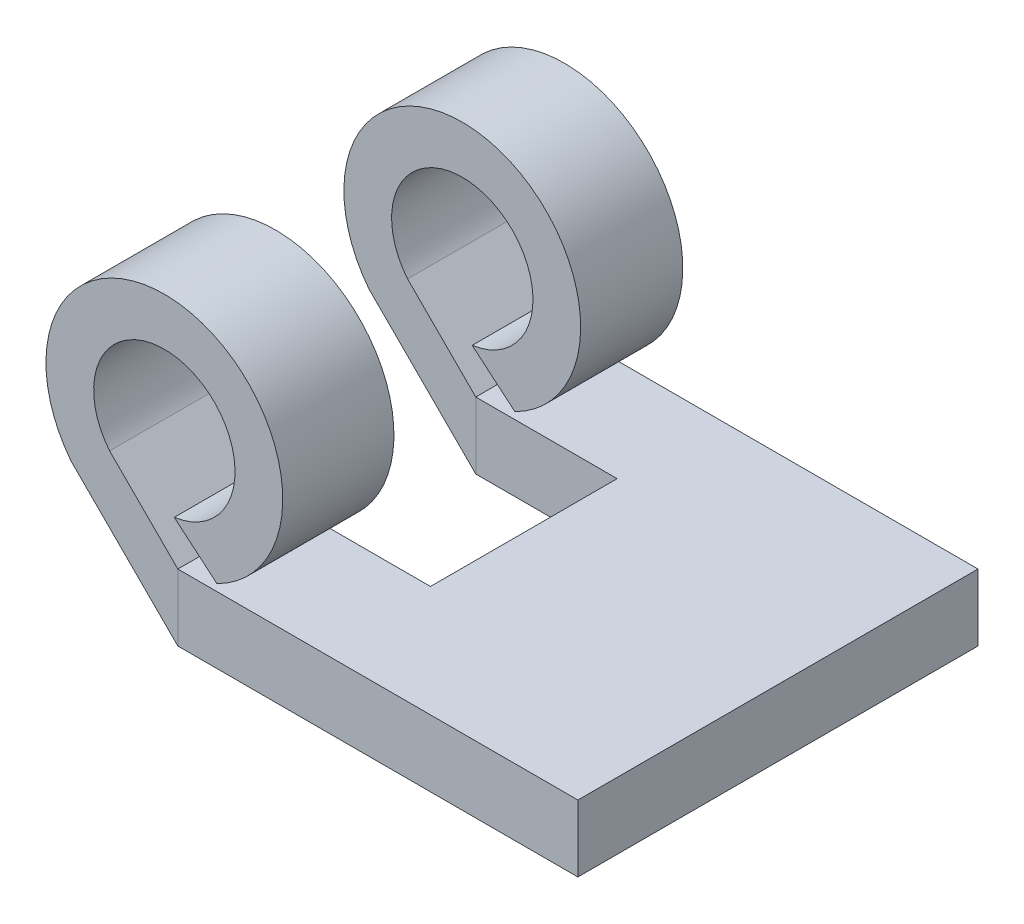
ISO-10303-21;
HEADER;
FILE_DESCRIPTION(('STEP AP214'),'2;1');
FILE_NAME('part.step','',(''),(''),'','','');
FILE_SCHEMA(('AUTOMOTIVE_DESIGN { 1 0 10303 214 1 1 1 1 }'));
ENDSEC;
DATA;
#1=APPLICATION_CONTEXT('core data for automotive mechanical design processes');
#2=APPLICATION_PROTOCOL_DEFINITION('international standard','automotive_design',2000,#1);
#3=PRODUCT_CONTEXT('',#1,'mechanical');
#4=PRODUCT('Part','Part','',(#3));
#5=PRODUCT_RELATED_PRODUCT_CATEGORY('part','',(#4));
#6=PRODUCT_DEFINITION_FORMATION('','',#4);
#7=PRODUCT_DEFINITION_CONTEXT('part definition',#1,'design');
#8=PRODUCT_DEFINITION('design','',#6,#7);
#9=PRODUCT_DEFINITION_SHAPE('','',#8);
#10=(LENGTH_UNIT() NAMED_UNIT(*) SI_UNIT(.MILLI.,.METRE.));
#11=(NAMED_UNIT(*) PLANE_ANGLE_UNIT() SI_UNIT($,.RADIAN.));
#12=(NAMED_UNIT(*) SI_UNIT($,.STERADIAN.) SOLID_ANGLE_UNIT());
#13=UNCERTAINTY_MEASURE_WITH_UNIT(LENGTH_MEASURE(1.E-05),#10,'distance_accuracy_value','');
#14=(GEOMETRIC_REPRESENTATION_CONTEXT(3) GLOBAL_UNCERTAINTY_ASSIGNED_CONTEXT((#13)) GLOBAL_UNIT_ASSIGNED_CONTEXT((#10,
#11,#12)) REPRESENTATION_CONTEXT('',''));
#15=CARTESIAN_POINT('',(0.,0.,0.));
#16=DIRECTION('',(0.,0.,1.));
#17=DIRECTION('',(1.,0.,0.));
#18=AXIS2_PLACEMENT_3D('',#15,#16,#17);
#19=CARTESIAN_POINT('',(0.,0.,0.));
#20=DIRECTION('',(1.,0.,0.));
#21=DIRECTION('',(0.,0.,-1.));
#22=AXIS2_PLACEMENT_3D('',#19,#20,#21);
#23=PLANE('',#22);
#24=DIRECTION('',(0.,1.,0.));
#25=VECTOR('',#24,1.);
#26=CARTESIAN_POINT('',(0.,0.,4.8641));
#27=LINE('',#26,#25);
#28=CARTESIAN_POINT('',(0.,0.,4.8641));
#29=VERTEX_POINT('',#28);
#30=CARTESIAN_POINT('',(0.,3.175,4.8641));
#31=VERTEX_POINT('',#30);
#32=EDGE_CURVE('E81',#29,#31,#27,.T.);
#33=ORIENTED_EDGE('',*,*,#32,.F.);
#34=DIRECTION('',(0.,0.,1.));
#35=VECTOR('',#34,1.);
#36=CARTESIAN_POINT('',(0.,0.,0.));
#37=LINE('',#36,#35);
#38=CARTESIAN_POINT('',(0.,0.,0.));
#39=VERTEX_POINT('',#38);
#40=EDGE_CURVE('E134',#39,#29,#37,.T.);
#41=ORIENTED_EDGE('',*,*,#40,.F.);
#42=DIRECTION('',(0.,1.,0.));
#43=VECTOR('',#42,1.);
#44=CARTESIAN_POINT('',(0.,0.,0.));
#45=LINE('',#44,#43);
#46=CARTESIAN_POINT('',(0.,3.175,0.));
#47=VERTEX_POINT('',#46);
#48=EDGE_CURVE('E127',#39,#47,#45,.T.);
#49=ORIENTED_EDGE('',*,*,#48,.T.);
#50=DIRECTION('',(0.,0.,1.));
#51=VECTOR('',#50,1.);
#52=CARTESIAN_POINT('',(0.,3.175,0.));
#53=LINE('',#52,#51);
#54=EDGE_CURVE('E50',#47,#31,#53,.T.);
#55=ORIENTED_EDGE('',*,*,#54,.T.);
#56=EDGE_LOOP('',(#33,#41,#49,#55));
#57=FACE_BOUND('',#56,.T.);
#58=ADVANCED_FACE('F47',(#57),#23,.T.);
#59=CARTESIAN_POINT('',(0.,0.,0.));
#60=DIRECTION('',(-0.707106781186544,-0.707106781186551,0.));
#61=DIRECTION('',(0.707106781186551,-0.707106781186544,0.));
#62=AXIS2_PLACEMENT_3D('',#59,#60,#61);
#63=PLANE('',#62);
#64=DIRECTION('',(0.707106781186551,-0.707106781186544,0.));
#65=VECTOR('',#64,1.);
#66=CARTESIAN_POINT('',(0.,0.,4.8641));
#67=LINE('',#66,#65);
#68=CARTESIAN_POINT('',(-5.08568187270977,5.08568187270972,4.8641));
#69=VERTEX_POINT('',#68);
#70=EDGE_CURVE('E12',#69,#29,#67,.T.);
#71=ORIENTED_EDGE('',*,*,#70,.F.);
#72=DIRECTION('',(0.,0.,1.));
#73=VECTOR('',#72,1.);
#74=CARTESIAN_POINT('',(-5.08568187270977,5.08568187270972,0.));
#75=LINE('',#74,#73);
#76=CARTESIAN_POINT('',(-5.08568187270977,5.08568187270972,0.));
#77=VERTEX_POINT('',#76);
#78=EDGE_CURVE('E139',#77,#69,#75,.T.);
#79=ORIENTED_EDGE('',*,*,#78,.F.);
#80=DIRECTION('',(0.707106781186551,-0.707106781186544,0.));
#81=VECTOR('',#80,1.);
#82=CARTESIAN_POINT('',(0.,0.,0.));
#83=LINE('',#82,#81);
#84=EDGE_CURVE('E138',#77,#39,#83,.T.);
#85=ORIENTED_EDGE('',*,*,#84,.T.);
#86=ORIENTED_EDGE('',*,*,#40,.T.);
#87=EDGE_LOOP('',(#71,#79,#85,#86));
#88=FACE_BOUND('',#87,.T.);
#89=ADVANCED_FACE('F155',(#88),#63,.T.);
#90=CARTESIAN_POINT('',(-0.641949721424772,8.55291528774449,0.));
#91=DIRECTION('',(0.,0.,1.));
#92=DIRECTION('',(1.,0.,0.));
#93=AXIS2_PLACEMENT_3D('',#90,#91,#92);
#94=CYLINDRICAL_SURFACE('',#93,5.63635192182831);
#95=CARTESIAN_POINT('',(-0.641949721424772,8.55291528774449,4.8641));
#96=DIRECTION('',(0.,0.,-1.));
#97=DIRECTION('',(-1.,0.,0.));
#98=AXIS2_PLACEMENT_3D('',#95,#96,#97);
#99=CIRCLE('',#98,5.63635192182831);
#100=CARTESIAN_POINT('',(1.86194414479549,3.5032639638012,4.8641));
#101=VERTEX_POINT('',#100);
#102=EDGE_CURVE('E55',#101,#69,#99,.F.);
#103=ORIENTED_EDGE('',*,*,#102,.F.);
#104=DIRECTION('',(0.,0.,1.));
#105=VECTOR('',#104,1.);
#106=CARTESIAN_POINT('',(1.86194414479549,3.5032639638012,0.));
#107=LINE('',#106,#105);
#108=CARTESIAN_POINT('',(1.86194414479549,3.5032639638012,0.));
#109=VERTEX_POINT('',#108);
#110=EDGE_CURVE('E119',#109,#101,#107,.T.);
#111=ORIENTED_EDGE('',*,*,#110,.F.);
#112=CARTESIAN_POINT('',(-0.641949721424772,8.55291528774449,0.));
#113=DIRECTION('',(0.,0.,1.));
#114=DIRECTION('',(-1.,0.,0.));
#115=AXIS2_PLACEMENT_3D('',#112,#113,#114);
#116=CIRCLE('',#115,5.63635192182831);
#117=EDGE_CURVE('E137',#109,#77,#116,.T.);
#118=ORIENTED_EDGE('',*,*,#117,.T.);
#119=ORIENTED_EDGE('',*,*,#78,.T.);
#120=EDGE_LOOP('',(#103,#111,#118,#119));
#121=FACE_BOUND('',#120,.T.);
#122=ADVANCED_FACE('F154',(#121),#94,.T.);
#123=CARTESIAN_POINT('',(-0.16937301081823,5.22075960371766,0.));
#124=DIRECTION('',(-0.645654947608014,-0.763629287435528,0.));
#125=DIRECTION('',(0.763629287435528,-0.645654947608014,0.));
#126=AXIS2_PLACEMENT_3D('',#123,#124,#125);
#127=PLANE('',#126);
#128=DIRECTION('',(0.763629287435528,-0.645654947608014,0.));
#129=VECTOR('',#128,1.);
#130=CARTESIAN_POINT('',(-0.16937301081823,5.22075960371766,4.8641));
#131=LINE('',#130,#129);
#132=CARTESIAN_POINT('',(-0.169373010818233,5.22075960371766,4.8641));
#133=VERTEX_POINT('',#132);
#134=EDGE_CURVE('E131',#133,#101,#131,.T.);
#135=ORIENTED_EDGE('',*,*,#134,.F.);
#136=DIRECTION('',(0.,0.,1.));
#137=VECTOR('',#136,1.);
#138=CARTESIAN_POINT('',(-0.169373010818233,5.22075960371766,0.));
#139=LINE('',#138,#137);
#140=CARTESIAN_POINT('',(-0.169373010818233,5.22075960371766,0.));
#141=VERTEX_POINT('',#140);
#142=EDGE_CURVE('E118',#141,#133,#139,.T.);
#143=ORIENTED_EDGE('',*,*,#142,.F.);
#144=DIRECTION('',(0.763629287435528,-0.645654947608014,0.));
#145=VECTOR('',#144,1.);
#146=CARTESIAN_POINT('',(-0.16937301081823,5.22075960371766,0.));
#147=LINE('',#146,#145);
#148=EDGE_CURVE('E117',#141,#109,#147,.T.);
#149=ORIENTED_EDGE('',*,*,#148,.T.);
#150=ORIENTED_EDGE('',*,*,#110,.T.);
#151=EDGE_LOOP('',(#135,#143,#149,#150));
#152=FACE_BOUND('',#151,.T.);
#153=ADVANCED_FACE('F161',(#152),#127,.T.);
#154=CARTESIAN_POINT('',(-0.641949721424772,8.55291528774449,0.));
#155=DIRECTION('',(0.,0.,1.));
#156=DIRECTION('',(1.,0.,0.));
#157=AXIS2_PLACEMENT_3D('',#154,#155,#156);
#158=CYLINDRICAL_SURFACE('',#157,3.3655);
#159=CARTESIAN_POINT('',(-0.641949721424772,8.55291528774449,4.8641));
#160=DIRECTION('',(0.,0.,-1.));
#161=DIRECTION('',(-1.,0.,0.));
#162=AXIS2_PLACEMENT_3D('',#159,#160,#161);
#163=CIRCLE('',#162,3.3655);
#164=CARTESIAN_POINT('',(-3.24647565848772,6.42147565848768,4.8641));
#165=VERTEX_POINT('',#164);
#166=EDGE_CURVE('E105',#165,#133,#163,.T.);
#167=ORIENTED_EDGE('',*,*,#166,.F.);
#168=DIRECTION('',(0.,0.,1.));
#169=VECTOR('',#168,1.);
#170=CARTESIAN_POINT('',(-3.24647565848772,6.42147565848768,0.));
#171=LINE('',#170,#169);
#172=CARTESIAN_POINT('',(-3.24647565848772,6.42147565848768,0.));
#173=VERTEX_POINT('',#172);
#174=EDGE_CURVE('E100',#173,#165,#171,.T.);
#175=ORIENTED_EDGE('',*,*,#174,.F.);
#176=CARTESIAN_POINT('',(-0.641949721424772,8.55291528774449,0.));
#177=DIRECTION('',(0.,0.,-1.));
#178=DIRECTION('',(-1.,0.,0.));
#179=AXIS2_PLACEMENT_3D('',#176,#177,#178);
#180=CIRCLE('',#179,3.3655);
#181=EDGE_CURVE('E104',#173,#141,#180,.T.);
#182=ORIENTED_EDGE('',*,*,#181,.T.);
#183=ORIENTED_EDGE('',*,*,#142,.T.);
#184=EDGE_LOOP('',(#167,#175,#182,#183));
#185=FACE_BOUND('',#184,.T.);
#186=ADVANCED_FACE('F102',(#185),#158,.F.);
#187=CARTESIAN_POINT('',(0.,3.175,0.));
#188=DIRECTION('',(0.707106781186544,0.707106781186551,0.));
#189=DIRECTION('',(-0.707106781186551,0.707106781186544,0.));
#190=AXIS2_PLACEMENT_3D('',#187,#188,#189);
#191=PLANE('',#190);
#192=DIRECTION('',(-0.707106781186551,0.707106781186544,0.));
#193=VECTOR('',#192,1.);
#194=CARTESIAN_POINT('',(0.,3.175,4.8641));
#195=LINE('',#194,#193);
#196=EDGE_CURVE('E78',#31,#165,#195,.T.);
#197=ORIENTED_EDGE('',*,*,#196,.F.);
#198=ORIENTED_EDGE('',*,*,#54,.F.);
#199=DIRECTION('',(-0.707106781186551,0.707106781186544,0.));
#200=VECTOR('',#199,1.);
#201=CARTESIAN_POINT('',(0.,3.175,0.));
#202=LINE('',#201,#200);
#203=EDGE_CURVE('E108',#47,#173,#202,.T.);
#204=ORIENTED_EDGE('',*,*,#203,.T.);
#205=ORIENTED_EDGE('',*,*,#174,.T.);
#206=EDGE_LOOP('',(#197,#198,#204,#205));
#207=FACE_BOUND('',#206,.T.);
#208=ADVANCED_FACE('F121',(#207),#191,.T.);
#209=CARTESIAN_POINT('',(-0.641949721424772,8.55291528774449,0.));
#210=DIRECTION('',(0.,0.,-1.));
#211=DIRECTION('',(-1.,0.,0.));
#212=AXIS2_PLACEMENT_3D('',#209,#210,#211);
#213=PLANE('',#212);
#214=ORIENTED_EDGE('',*,*,#48,.F.);
#215=ORIENTED_EDGE('',*,*,#84,.F.);
#216=ORIENTED_EDGE('',*,*,#117,.F.);
#217=ORIENTED_EDGE('',*,*,#148,.F.);
#218=ORIENTED_EDGE('',*,*,#181,.F.);
#219=ORIENTED_EDGE('',*,*,#203,.F.);
#220=EDGE_LOOP('',(#214,#215,#216,#217,#218,#219));
#221=FACE_BOUND('',#220,.T.);
#222=ADVANCED_FACE('F113',(#221),#213,.T.);
#223=CARTESIAN_POINT('',(6.73332256851049,19.05,4.8641));
#224=DIRECTION('',(0.,0.,-1.));
#225=DIRECTION('',(-1.,0.,0.));
#226=AXIS2_PLACEMENT_3D('',#223,#224,#225);
#227=PLANE('',#226);
#228=ORIENTED_EDGE('',*,*,#32,.T.);
#229=ORIENTED_EDGE('',*,*,#196,.T.);
#230=ORIENTED_EDGE('',*,*,#166,.T.);
#231=ORIENTED_EDGE('',*,*,#134,.T.);
#232=ORIENTED_EDGE('',*,*,#102,.T.);
#233=ORIENTED_EDGE('',*,*,#70,.T.);
#234=EDGE_LOOP('',(#228,#229,#230,#231,#232,#233));
#235=FACE_BOUND('',#234,.T.);
#236=ADVANCED_FACE('F170',(#235),#227,.F.);
#237=CLOSED_SHELL('',(#58,#89,#122,#153,#186,#208,#222,#236));
#238=MANIFOLD_SOLID_BREP('B2',#237);
#239=CARTESIAN_POINT('',(-0.641949721424772,8.55291528774449,19.05));
#240=DIRECTION('',(0.,0.,-1.));
#241=DIRECTION('',(-1.,0.,0.));
#242=AXIS2_PLACEMENT_3D('',#239,#240,#241);
#243=PLANE('',#242);
#244=DIRECTION('',(0.,1.,0.));
#245=VECTOR('',#244,1.);
#246=CARTESIAN_POINT('',(0.,0.,19.05));
#247=LINE('',#246,#245);
#248=CARTESIAN_POINT('',(0.,0.,19.05));
#249=VERTEX_POINT('',#248);
#250=CARTESIAN_POINT('',(0.,3.175,19.05));
#251=VERTEX_POINT('',#250);
#252=EDGE_CURVE('E288',#249,#251,#247,.T.);
#253=ORIENTED_EDGE('',*,*,#252,.T.);
#254=DIRECTION('',(-0.707106781186551,0.707106781186544,0.));
#255=VECTOR('',#254,1.);
#256=CARTESIAN_POINT('',(0.,3.175,19.05));
#257=LINE('',#256,#255);
#258=CARTESIAN_POINT('',(-3.24647565848772,6.42147565848768,19.05));
#259=VERTEX_POINT('',#258);
#260=EDGE_CURVE('E321',#251,#259,#257,.T.);
#261=ORIENTED_EDGE('',*,*,#260,.T.);
#262=CARTESIAN_POINT('',(-0.641949721424772,8.55291528774449,19.05));
#263=DIRECTION('',(0.,0.,-1.));
#264=DIRECTION('',(-1.,0.,0.));
#265=AXIS2_PLACEMENT_3D('',#262,#263,#264);
#266=CIRCLE('',#265,3.3655);
#267=CARTESIAN_POINT('',(-0.169373010818233,5.22075960371766,19.05));
#268=VERTEX_POINT('',#267);
#269=EDGE_CURVE('E316',#259,#268,#266,.T.);
#270=ORIENTED_EDGE('',*,*,#269,.T.);
#271=DIRECTION('',(0.763629287435528,-0.645654947608014,0.));
#272=VECTOR('',#271,1.);
#273=CARTESIAN_POINT('',(-0.16937301081823,5.22075960371766,19.05));
#274=LINE('',#273,#272);
#275=CARTESIAN_POINT('',(1.86194414479549,3.5032639638012,19.05));
#276=VERTEX_POINT('',#275);
#277=EDGE_CURVE('E313',#268,#276,#274,.T.);
#278=ORIENTED_EDGE('',*,*,#277,.T.);
#279=CARTESIAN_POINT('',(-0.641949721424772,8.55291528774449,19.05));
#280=DIRECTION('',(0.,0.,1.));
#281=DIRECTION('',(-1.,0.,0.));
#282=AXIS2_PLACEMENT_3D('',#279,#280,#281);
#283=CIRCLE('',#282,5.63635192182831);
#284=CARTESIAN_POINT('',(-5.08568187270977,5.08568187270972,19.05));
#285=VERTEX_POINT('',#284);
#286=EDGE_CURVE('E310',#276,#285,#283,.T.);
#287=ORIENTED_EDGE('',*,*,#286,.T.);
#288=DIRECTION('',(0.707106781186551,-0.707106781186544,0.));
#289=VECTOR('',#288,1.);
#290=CARTESIAN_POINT('',(0.,0.,19.05));
#291=LINE('',#290,#289);
#292=EDGE_CURVE('E301',#285,#249,#291,.T.);
#293=ORIENTED_EDGE('',*,*,#292,.T.);
#294=EDGE_LOOP('',(#253,#261,#270,#278,#287,#293));
#295=FACE_BOUND('',#294,.T.);
#296=ADVANCED_FACE('F231',(#295),#243,.F.);
#297=CARTESIAN_POINT('',(0.,3.175,0.));
#298=DIRECTION('',(0.707106781186544,0.707106781186551,0.));
#299=DIRECTION('',(-0.707106781186551,0.707106781186544,0.));
#300=AXIS2_PLACEMENT_3D('',#297,#298,#299);
#301=PLANE('',#300);
#302=DIRECTION('',(0.707106781186551,-0.707106781186544,0.));
#303=VECTOR('',#302,1.);
#304=CARTESIAN_POINT('',(0.,3.175,13.7541));
#305=LINE('',#304,#303);
#306=CARTESIAN_POINT('',(-3.24647565848772,6.42147565848768,13.7541));
#307=VERTEX_POINT('',#306);
#308=CARTESIAN_POINT('',(0.,3.175,13.7541));
#309=VERTEX_POINT('',#308);
#310=EDGE_CURVE('E45',#307,#309,#305,.T.);
#311=ORIENTED_EDGE('',*,*,#310,.F.);
#312=DIRECTION('',(0.,0.,1.));
#313=VECTOR('',#312,1.);
#314=CARTESIAN_POINT('',(-3.24647565848772,6.42147565848768,0.));
#315=LINE('',#314,#313);
#316=EDGE_CURVE('E307',#307,#259,#315,.T.);
#317=ORIENTED_EDGE('',*,*,#316,.T.);
#318=ORIENTED_EDGE('',*,*,#260,.F.);
#319=DIRECTION('',(0.,0.,1.));
#320=VECTOR('',#319,1.);
#321=CARTESIAN_POINT('',(0.,3.175,0.));
#322=LINE('',#321,#320);
#323=EDGE_CURVE('E308',#309,#251,#322,.T.);
#324=ORIENTED_EDGE('',*,*,#323,.F.);
#325=EDGE_LOOP('',(#311,#317,#318,#324));
#326=FACE_BOUND('',#325,.T.);
#327=ADVANCED_FACE('F339',(#326),#301,.T.);
#328=CARTESIAN_POINT('',(-0.641949721424772,8.55291528774449,0.));
#329=DIRECTION('',(0.,0.,1.));
#330=DIRECTION('',(1.,0.,0.));
#331=AXIS2_PLACEMENT_3D('',#328,#329,#330);
#332=CYLINDRICAL_SURFACE('',#331,3.3655);
#333=CARTESIAN_POINT('',(-0.641949721424772,8.55291528774449,13.7541));
#334=DIRECTION('',(0.,0.,1.));
#335=DIRECTION('',(1.,0.,0.));
#336=AXIS2_PLACEMENT_3D('',#333,#334,#335);
#337=CIRCLE('',#336,3.3655);
#338=CARTESIAN_POINT('',(-0.169373010818233,5.22075960371766,13.7541));
#339=VERTEX_POINT('',#338);
#340=EDGE_CURVE('E245',#339,#307,#337,.T.);
#341=ORIENTED_EDGE('',*,*,#340,.F.);
#342=DIRECTION('',(0.,0.,1.));
#343=VECTOR('',#342,1.);
#344=CARTESIAN_POINT('',(-0.169373010818233,5.22075960371766,0.));
#345=LINE('',#344,#343);
#346=EDGE_CURVE('E305',#339,#268,#345,.T.);
#347=ORIENTED_EDGE('',*,*,#346,.T.);
#348=ORIENTED_EDGE('',*,*,#269,.F.);
#349=ORIENTED_EDGE('',*,*,#316,.F.);
#350=EDGE_LOOP('',(#341,#347,#348,#349));
#351=FACE_BOUND('',#350,.T.);
#352=ADVANCED_FACE('F334',(#351),#332,.F.);
#353=CARTESIAN_POINT('',(-0.16937301081823,5.22075960371766,0.));
#354=DIRECTION('',(-0.645654947608014,-0.763629287435528,0.));
#355=DIRECTION('',(0.763629287435528,-0.645654947608014,0.));
#356=AXIS2_PLACEMENT_3D('',#353,#354,#355);
#357=PLANE('',#356);
#358=DIRECTION('',(-0.763629287435528,0.645654947608014,0.));
#359=VECTOR('',#358,1.);
#360=CARTESIAN_POINT('',(-0.169373010818231,5.22075960371766,13.7541));
#361=LINE('',#360,#359);
#362=CARTESIAN_POINT('',(1.86194414479549,3.5032639638012,13.7541));
#363=VERTEX_POINT('',#362);
#364=EDGE_CURVE('E326',#363,#339,#361,.T.);
#365=ORIENTED_EDGE('',*,*,#364,.F.);
#366=DIRECTION('',(0.,0.,1.));
#367=VECTOR('',#366,1.);
#368=CARTESIAN_POINT('',(1.86194414479549,3.5032639638012,0.));
#369=LINE('',#368,#367);
#370=EDGE_CURVE('E298',#363,#276,#369,.T.);
#371=ORIENTED_EDGE('',*,*,#370,.T.);
#372=ORIENTED_EDGE('',*,*,#277,.F.);
#373=ORIENTED_EDGE('',*,*,#346,.F.);
#374=EDGE_LOOP('',(#365,#371,#372,#373));
#375=FACE_BOUND('',#374,.T.);
#376=ADVANCED_FACE('F337',(#375),#357,.T.);
#377=CARTESIAN_POINT('',(-0.641949721424772,8.55291528774449,0.));
#378=DIRECTION('',(0.,0.,1.));
#379=DIRECTION('',(1.,0.,0.));
#380=AXIS2_PLACEMENT_3D('',#377,#378,#379);
#381=CYLINDRICAL_SURFACE('',#380,5.63635192182831);
#382=CARTESIAN_POINT('',(-0.641949721424772,8.55291528774449,13.7541));
#383=DIRECTION('',(0.,0.,1.));
#384=DIRECTION('',(1.,0.,0.));
#385=AXIS2_PLACEMENT_3D('',#382,#383,#384);
#386=CIRCLE('',#385,5.63635192182831);
#387=CARTESIAN_POINT('',(-5.08568187270977,5.08568187270972,13.7541));
#388=VERTEX_POINT('',#387);
#389=EDGE_CURVE('E293',#388,#363,#386,.F.);
#390=ORIENTED_EDGE('',*,*,#389,.F.);
#391=DIRECTION('',(0.,0.,1.));
#392=VECTOR('',#391,1.);
#393=CARTESIAN_POINT('',(-5.08568187270977,5.08568187270972,0.));
#394=LINE('',#393,#392);
#395=EDGE_CURVE('E292',#388,#285,#394,.T.);
#396=ORIENTED_EDGE('',*,*,#395,.T.);
#397=ORIENTED_EDGE('',*,*,#286,.F.);
#398=ORIENTED_EDGE('',*,*,#370,.F.);
#399=EDGE_LOOP('',(#390,#396,#397,#398));
#400=FACE_BOUND('',#399,.T.);
#401=ADVANCED_FACE('F350',(#400),#381,.T.);
#402=CARTESIAN_POINT('',(0.,0.,0.));
#403=DIRECTION('',(-0.707106781186544,-0.707106781186551,0.));
#404=DIRECTION('',(0.707106781186551,-0.707106781186544,0.));
#405=AXIS2_PLACEMENT_3D('',#402,#403,#404);
#406=PLANE('',#405);
#407=DIRECTION('',(-0.707106781186551,0.707106781186544,0.));
#408=VECTOR('',#407,1.);
#409=CARTESIAN_POINT('',(0.,0.,13.7541));
#410=LINE('',#409,#408);
#411=CARTESIAN_POINT('',(0.,0.,13.7541));
#412=VERTEX_POINT('',#411);
#413=EDGE_CURVE('E284',#412,#388,#410,.T.);
#414=ORIENTED_EDGE('',*,*,#413,.F.);
#415=DIRECTION('',(0.,0.,1.));
#416=VECTOR('',#415,1.);
#417=CARTESIAN_POINT('',(0.,0.,0.));
#418=LINE('',#417,#416);
#419=EDGE_CURVE('E239',#412,#249,#418,.T.);
#420=ORIENTED_EDGE('',*,*,#419,.T.);
#421=ORIENTED_EDGE('',*,*,#292,.F.);
#422=ORIENTED_EDGE('',*,*,#395,.F.);
#423=EDGE_LOOP('',(#414,#420,#421,#422));
#424=FACE_BOUND('',#423,.T.);
#425=ADVANCED_FACE('F291',(#424),#406,.T.);
#426=CARTESIAN_POINT('',(0.,0.,0.));
#427=DIRECTION('',(1.,0.,0.));
#428=DIRECTION('',(0.,0.,-1.));
#429=AXIS2_PLACEMENT_3D('',#426,#427,#428);
#430=PLANE('',#429);
#431=DIRECTION('',(0.,-1.,0.));
#432=VECTOR('',#431,1.);
#433=CARTESIAN_POINT('',(0.,0.,13.7541));
#434=LINE('',#433,#432);
#435=EDGE_CURVE('E282',#309,#412,#434,.T.);
#436=ORIENTED_EDGE('',*,*,#435,.F.);
#437=ORIENTED_EDGE('',*,*,#323,.T.);
#438=ORIENTED_EDGE('',*,*,#252,.F.);
#439=ORIENTED_EDGE('',*,*,#419,.F.);
#440=EDGE_LOOP('',(#436,#437,#438,#439));
#441=FACE_BOUND('',#440,.T.);
#442=ADVANCED_FACE('F233',(#441),#430,.T.);
#443=CARTESIAN_POINT('',(6.73332256851049,19.05,13.7541));
#444=DIRECTION('',(0.,0.,1.));
#445=DIRECTION('',(1.,0.,0.));
#446=AXIS2_PLACEMENT_3D('',#443,#444,#445);
#447=PLANE('',#446);
#448=ORIENTED_EDGE('',*,*,#435,.T.);
#449=ORIENTED_EDGE('',*,*,#413,.T.);
#450=ORIENTED_EDGE('',*,*,#389,.T.);
#451=ORIENTED_EDGE('',*,*,#364,.T.);
#452=ORIENTED_EDGE('',*,*,#340,.T.);
#453=ORIENTED_EDGE('',*,*,#310,.T.);
#454=EDGE_LOOP('',(#448,#449,#450,#451,#452,#453));
#455=FACE_BOUND('',#454,.T.);
#456=ADVANCED_FACE('F283',(#455),#447,.F.);
#457=CLOSED_SHELL('',(#296,#327,#352,#376,#401,#425,#442,#456));
#458=MANIFOLD_SOLID_BREP('B6',#457);
#459=CARTESIAN_POINT('',(0.,0.,19.05));
#460=DIRECTION('',(1.,0.,0.));
#461=DIRECTION('',(0.,0.,-1.));
#462=AXIS2_PLACEMENT_3D('',#459,#460,#461);
#463=PLANE('',#462);
#464=DIRECTION('',(0.,0.,-1.));
#465=VECTOR('',#464,1.);
#466=CARTESIAN_POINT('',(0.,0.,19.05));
#467=LINE('',#466,#465);
#468=CARTESIAN_POINT('',(0.,0.,4.8641));
#469=VERTEX_POINT('',#468);
#470=CARTESIAN_POINT('',(0.,0.,0.));
#471=VERTEX_POINT('',#470);
#472=EDGE_CURVE('E531',#469,#471,#467,.T.);
#473=ORIENTED_EDGE('',*,*,#472,.F.);
#474=DIRECTION('',(0.,1.,0.));
#475=VECTOR('',#474,1.);
#476=CARTESIAN_POINT('',(0.,0.,4.8641));
#477=LINE('',#476,#475);
#478=CARTESIAN_POINT('',(0.,3.175,4.8641));
#479=VERTEX_POINT('',#478);
#480=EDGE_CURVE('E506',#469,#479,#477,.T.);
#481=ORIENTED_EDGE('',*,*,#480,.T.);
#482=DIRECTION('',(0.,0.,-1.));
#483=VECTOR('',#482,1.);
#484=CARTESIAN_POINT('',(0.,3.175,19.05));
#485=LINE('',#484,#483);
#486=CARTESIAN_POINT('',(0.,3.175,0.));
#487=VERTEX_POINT('',#486);
#488=EDGE_CURVE('E452',#479,#487,#485,.T.);
#489=ORIENTED_EDGE('',*,*,#488,.T.);
#490=DIRECTION('',(0.,-1.,0.));
#491=VECTOR('',#490,1.);
#492=CARTESIAN_POINT('',(0.,0.,0.));
#493=LINE('',#492,#491);
#494=EDGE_CURVE('E508',#487,#471,#493,.T.);
#495=ORIENTED_EDGE('',*,*,#494,.T.);
#496=EDGE_LOOP('',(#473,#481,#489,#495));
#497=FACE_BOUND('',#496,.T.);
#498=ADVANCED_FACE('F406',(#497),#463,.F.);
#499=CARTESIAN_POINT('',(0.,3.175,19.05));
#500=VERTEX_POINT('',#499);
#501=CARTESIAN_POINT('',(0.,3.175,13.7541));
#502=VERTEX_POINT('',#501);
#503=EDGE_CURVE('E522',#500,#502,#485,.T.);
#504=ORIENTED_EDGE('',*,*,#503,.T.);
#505=DIRECTION('',(0.,-1.,0.));
#506=VECTOR('',#505,1.);
#507=CARTESIAN_POINT('',(0.,0.,13.7541));
#508=LINE('',#507,#506);
#509=CARTESIAN_POINT('',(0.,0.,13.7541));
#510=VERTEX_POINT('',#509);
#511=EDGE_CURVE('E421',#502,#510,#508,.T.);
#512=ORIENTED_EDGE('',*,*,#511,.T.);
#513=CARTESIAN_POINT('',(0.,0.,19.05));
#514=VERTEX_POINT('',#513);
#515=EDGE_CURVE('E500',#514,#510,#467,.T.);
#516=ORIENTED_EDGE('',*,*,#515,.F.);
#517=DIRECTION('',(0.,-1.,0.));
#518=VECTOR('',#517,1.);
#519=CARTESIAN_POINT('',(0.,0.,19.05));
#520=LINE('',#519,#518);
#521=EDGE_CURVE('E509',#500,#514,#520,.T.);
#522=ORIENTED_EDGE('',*,*,#521,.F.);
#523=EDGE_LOOP('',(#504,#512,#516,#522));
#524=FACE_BOUND('',#523,.T.);
#525=ADVANCED_FACE('F408',(#524),#463,.F.);
#526=CARTESIAN_POINT('',(0.,0.,19.05));
#527=DIRECTION('',(0.,1.,0.));
#528=DIRECTION('',(0.,0.,1.));
#529=AXIS2_PLACEMENT_3D('',#526,#527,#528);
#530=PLANE('',#529);
#531=DIRECTION('',(0.,0.,1.));
#532=VECTOR('',#531,1.);
#533=CARTESIAN_POINT('',(6.73332256851049,0.,13.7541));
#534=LINE('',#533,#532);
#535=CARTESIAN_POINT('',(6.73332256851049,0.,4.8641));
#536=VERTEX_POINT('',#535);
#537=CARTESIAN_POINT('',(6.73332256851049,0.,13.7541));
#538=VERTEX_POINT('',#537);
#539=EDGE_CURVE('E492',#536,#538,#534,.T.);
#540=ORIENTED_EDGE('',*,*,#539,.F.);
#541=DIRECTION('',(1.,0.,0.));
#542=VECTOR('',#541,1.);
#543=CARTESIAN_POINT('',(6.73332256851049,0.,4.8641));
#544=LINE('',#543,#542);
#545=EDGE_CURVE('E489',#469,#536,#544,.T.);
#546=ORIENTED_EDGE('',*,*,#545,.F.);
#547=ORIENTED_EDGE('',*,*,#472,.T.);
#548=DIRECTION('',(1.,0.,0.));
#549=VECTOR('',#548,1.);
#550=CARTESIAN_POINT('',(0.,0.,0.));
#551=LINE('',#550,#549);
#552=CARTESIAN_POINT('',(19.05,0.,0.));
#553=VERTEX_POINT('',#552);
#554=EDGE_CURVE('E517',#471,#553,#551,.T.);
#555=ORIENTED_EDGE('',*,*,#554,.T.);
#556=DIRECTION('',(0.,0.,-1.));
#557=VECTOR('',#556,1.);
#558=CARTESIAN_POINT('',(19.05,0.,19.05));
#559=LINE('',#558,#557);
#560=CARTESIAN_POINT('',(19.05,0.,19.05));
#561=VERTEX_POINT('',#560);
#562=EDGE_CURVE('E528',#561,#553,#559,.T.);
#563=ORIENTED_EDGE('',*,*,#562,.F.);
#564=DIRECTION('',(1.,0.,0.));
#565=VECTOR('',#564,1.);
#566=CARTESIAN_POINT('',(0.,0.,19.05));
#567=LINE('',#566,#565);
#568=EDGE_CURVE('E460',#514,#561,#567,.T.);
#569=ORIENTED_EDGE('',*,*,#568,.F.);
#570=ORIENTED_EDGE('',*,*,#515,.T.);
#571=DIRECTION('',(-1.,0.,0.));
#572=VECTOR('',#571,1.);
#573=CARTESIAN_POINT('',(6.73332256851049,0.,13.7541));
#574=LINE('',#573,#572);
#575=EDGE_CURVE('E484',#538,#510,#574,.T.);
#576=ORIENTED_EDGE('',*,*,#575,.F.);
#577=EDGE_LOOP('',(#540,#546,#547,#555,#563,#569,#570,#576));
#578=FACE_BOUND('',#577,.T.);
#579=ADVANCED_FACE('F498',(#578),#530,.F.);
#580=CARTESIAN_POINT('',(19.05,0.,19.05));
#581=DIRECTION('',(-1.,0.,0.));
#582=DIRECTION('',(0.,0.,1.));
#583=AXIS2_PLACEMENT_3D('',#580,#581,#582);
#584=PLANE('',#583);
#585=DIRECTION('',(0.,1.,0.));
#586=VECTOR('',#585,1.);
#587=CARTESIAN_POINT('',(19.05,0.,0.));
#588=LINE('',#587,#586);
#589=CARTESIAN_POINT('',(19.05,3.175,0.));
#590=VERTEX_POINT('',#589);
#591=EDGE_CURVE('E519',#553,#590,#588,.T.);
#592=ORIENTED_EDGE('',*,*,#591,.T.);
#593=DIRECTION('',(0.,0.,-1.));
#594=VECTOR('',#593,1.);
#595=CARTESIAN_POINT('',(19.05,3.175,19.05));
#596=LINE('',#595,#594);
#597=CARTESIAN_POINT('',(19.05,3.175,19.05));
#598=VERTEX_POINT('',#597);
#599=EDGE_CURVE('E525',#598,#590,#596,.T.);
#600=ORIENTED_EDGE('',*,*,#599,.F.);
#601=DIRECTION('',(0.,1.,0.));
#602=VECTOR('',#601,1.);
#603=CARTESIAN_POINT('',(19.05,0.,19.05));
#604=LINE('',#603,#602);
#605=EDGE_CURVE('E513',#561,#598,#604,.T.);
#606=ORIENTED_EDGE('',*,*,#605,.F.);
#607=ORIENTED_EDGE('',*,*,#562,.T.);
#608=EDGE_LOOP('',(#592,#600,#606,#607));
#609=FACE_BOUND('',#608,.T.);
#610=ADVANCED_FACE('F546',(#609),#584,.F.);
#611=CARTESIAN_POINT('',(0.,3.175,19.05));
#612=DIRECTION('',(0.,-1.,0.));
#613=DIRECTION('',(0.,0.,-1.));
#614=AXIS2_PLACEMENT_3D('',#611,#612,#613);
#615=PLANE('',#614);
#616=ORIENTED_EDGE('',*,*,#488,.F.);
#617=DIRECTION('',(1.,0.,0.));
#618=VECTOR('',#617,1.);
#619=CARTESIAN_POINT('',(0.,3.175,4.8641));
#620=LINE('',#619,#618);
#621=CARTESIAN_POINT('',(6.73332256851049,3.17500000000001,4.8641));
#622=VERTEX_POINT('',#621);
#623=EDGE_CURVE('E229',#479,#622,#620,.T.);
#624=ORIENTED_EDGE('',*,*,#623,.T.);
#625=DIRECTION('',(0.,0.,1.));
#626=VECTOR('',#625,1.);
#627=CARTESIAN_POINT('',(6.73332256851049,3.175,19.05));
#628=LINE('',#627,#626);
#629=CARTESIAN_POINT('',(6.73332256851049,3.17500000000001,13.7541));
#630=VERTEX_POINT('',#629);
#631=EDGE_CURVE('E414',#622,#630,#628,.T.);
#632=ORIENTED_EDGE('',*,*,#631,.T.);
#633=DIRECTION('',(-1.,0.,0.));
#634=VECTOR('',#633,1.);
#635=CARTESIAN_POINT('',(0.,3.175,13.7541));
#636=LINE('',#635,#634);
#637=EDGE_CURVE('E485',#630,#502,#636,.T.);
#638=ORIENTED_EDGE('',*,*,#637,.T.);
#639=ORIENTED_EDGE('',*,*,#503,.F.);
#640=DIRECTION('',(-1.,0.,0.));
#641=VECTOR('',#640,1.);
#642=CARTESIAN_POINT('',(0.,3.175,19.05));
#643=LINE('',#642,#641);
#644=EDGE_CURVE('E430',#598,#500,#643,.T.);
#645=ORIENTED_EDGE('',*,*,#644,.F.);
#646=ORIENTED_EDGE('',*,*,#599,.T.);
#647=DIRECTION('',(-1.,0.,0.));
#648=VECTOR('',#647,1.);
#649=CARTESIAN_POINT('',(0.,3.175,0.));
#650=LINE('',#649,#648);
#651=EDGE_CURVE('E511',#590,#487,#650,.T.);
#652=ORIENTED_EDGE('',*,*,#651,.T.);
#653=EDGE_LOOP('',(#616,#624,#632,#638,#639,#645,#646,#652));
#654=FACE_BOUND('',#653,.T.);
#655=ADVANCED_FACE('F534',(#654),#615,.F.);
#656=CARTESIAN_POINT('',(0.,0.,19.05));
#657=DIRECTION('',(0.,0.,-1.));
#658=DIRECTION('',(-1.,0.,0.));
#659=AXIS2_PLACEMENT_3D('',#656,#657,#658);
#660=PLANE('',#659);
#661=ORIENTED_EDGE('',*,*,#521,.T.);
#662=ORIENTED_EDGE('',*,*,#568,.T.);
#663=ORIENTED_EDGE('',*,*,#605,.T.);
#664=ORIENTED_EDGE('',*,*,#644,.T.);
#665=EDGE_LOOP('',(#661,#662,#663,#664));
#666=FACE_BOUND('',#665,.T.);
#667=ADVANCED_FACE('F548',(#666),#660,.F.);
#668=CARTESIAN_POINT('',(0.,0.,0.));
#669=DIRECTION('',(0.,0.,-1.));
#670=DIRECTION('',(-1.,0.,0.));
#671=AXIS2_PLACEMENT_3D('',#668,#669,#670);
#672=PLANE('',#671);
#673=ORIENTED_EDGE('',*,*,#494,.F.);
#674=ORIENTED_EDGE('',*,*,#651,.F.);
#675=ORIENTED_EDGE('',*,*,#591,.F.);
#676=ORIENTED_EDGE('',*,*,#554,.F.);
#677=EDGE_LOOP('',(#673,#674,#675,#676));
#678=FACE_BOUND('',#677,.T.);
#679=ADVANCED_FACE('F542',(#678),#672,.T.);
#680=CARTESIAN_POINT('',(6.73332256851049,19.05,13.7541));
#681=DIRECTION('',(1.,0.,0.));
#682=DIRECTION('',(0.,0.,-1.));
#683=AXIS2_PLACEMENT_3D('',#680,#681,#682);
#684=PLANE('',#683);
#685=DIRECTION('',(0.,-1.,0.));
#686=VECTOR('',#685,1.);
#687=CARTESIAN_POINT('',(6.73332256851049,19.05,4.8641));
#688=LINE('',#687,#686);
#689=EDGE_CURVE('E488',#622,#536,#688,.T.);
#690=ORIENTED_EDGE('',*,*,#689,.T.);
#691=ORIENTED_EDGE('',*,*,#539,.T.);
#692=DIRECTION('',(0.,-1.,0.));
#693=VECTOR('',#692,1.);
#694=CARTESIAN_POINT('',(6.73332256851049,19.05,13.7541));
#695=LINE('',#694,#693);
#696=EDGE_CURVE('E480',#630,#538,#695,.T.);
#697=ORIENTED_EDGE('',*,*,#696,.F.);
#698=ORIENTED_EDGE('',*,*,#631,.F.);
#699=EDGE_LOOP('',(#690,#691,#697,#698));
#700=FACE_BOUND('',#699,.T.);
#701=ADVANCED_FACE('F493',(#700),#684,.F.);
#702=CARTESIAN_POINT('',(6.73332256851049,19.05,4.8641));
#703=DIRECTION('',(0.,0.,-1.));
#704=DIRECTION('',(-1.,0.,0.));
#705=AXIS2_PLACEMENT_3D('',#702,#703,#704);
#706=PLANE('',#705);
#707=ORIENTED_EDGE('',*,*,#545,.T.);
#708=ORIENTED_EDGE('',*,*,#689,.F.);
#709=ORIENTED_EDGE('',*,*,#623,.F.);
#710=ORIENTED_EDGE('',*,*,#480,.F.);
#711=EDGE_LOOP('',(#707,#708,#709,#710));
#712=FACE_BOUND('',#711,.T.);
#713=ADVANCED_FACE('F536',(#712),#706,.F.);
#714=CARTESIAN_POINT('',(6.73332256851049,19.05,13.7541));
#715=DIRECTION('',(0.,0.,1.));
#716=DIRECTION('',(1.,0.,0.));
#717=AXIS2_PLACEMENT_3D('',#714,#715,#716);
#718=PLANE('',#717);
#719=ORIENTED_EDGE('',*,*,#637,.F.);
#720=ORIENTED_EDGE('',*,*,#696,.T.);
#721=ORIENTED_EDGE('',*,*,#575,.T.);
#722=ORIENTED_EDGE('',*,*,#511,.F.);
#723=EDGE_LOOP('',(#719,#720,#721,#722));
#724=FACE_BOUND('',#723,.T.);
#725=ADVANCED_FACE('F482',(#724),#718,.F.);
#726=CLOSED_SHELL('',(#498,#525,#579,#610,#655,#667,#679,#701,#713,#725));
#727=MANIFOLD_SOLID_BREP('B39',#726);
#728=ADVANCED_BREP_SHAPE_REPRESENTATION('',(#18,#238,#458,#727),#14);
#729=SHAPE_DEFINITION_REPRESENTATION(#9,#728);
ENDSEC;
END-ISO-10303-21;
